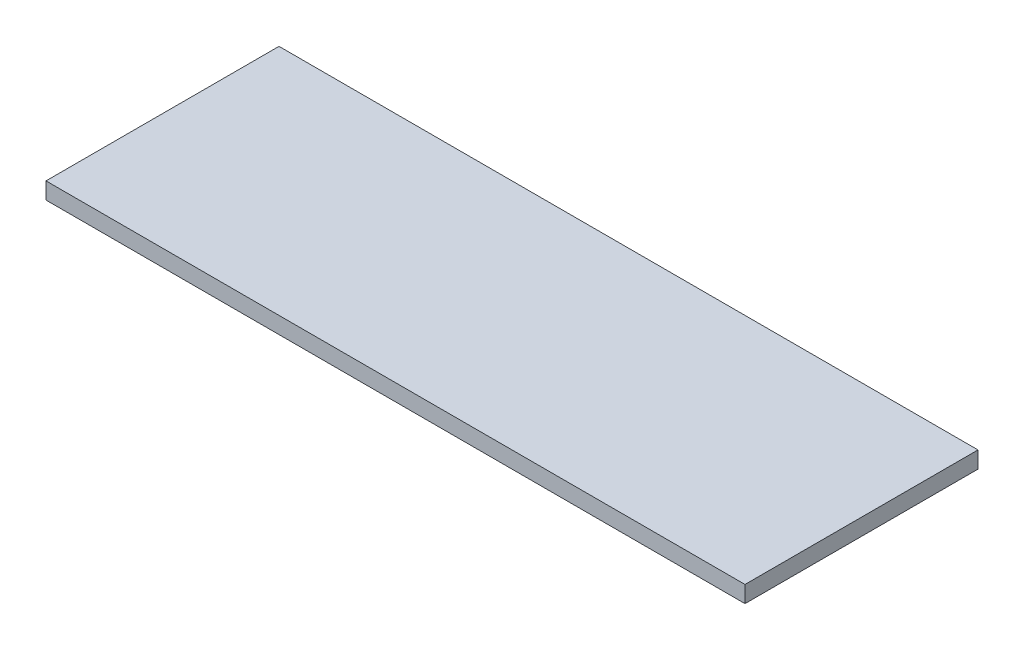
ISO-10303-21;
HEADER;
FILE_DESCRIPTION(('STEP AP214'),'2;1');
FILE_NAME('part.step','',(''),(''),'','','');
FILE_SCHEMA(('AUTOMOTIVE_DESIGN { 1 0 10303 214 1 1 1 1 }'));
ENDSEC;
DATA;
#1=APPLICATION_CONTEXT('core data for automotive mechanical design processes');
#2=APPLICATION_PROTOCOL_DEFINITION('international standard','automotive_design',2000,#1);
#3=PRODUCT_CONTEXT('',#1,'mechanical');
#4=PRODUCT('Part','Part','',(#3));
#5=PRODUCT_RELATED_PRODUCT_CATEGORY('part','',(#4));
#6=PRODUCT_DEFINITION_FORMATION('','',#4);
#7=PRODUCT_DEFINITION_CONTEXT('part definition',#1,'design');
#8=PRODUCT_DEFINITION('design','',#6,#7);
#9=PRODUCT_DEFINITION_SHAPE('','',#8);
#10=(LENGTH_UNIT() NAMED_UNIT(*) SI_UNIT(.MILLI.,.METRE.));
#11=(NAMED_UNIT(*) PLANE_ANGLE_UNIT() SI_UNIT($,.RADIAN.));
#12=(NAMED_UNIT(*) SI_UNIT($,.STERADIAN.) SOLID_ANGLE_UNIT());
#13=UNCERTAINTY_MEASURE_WITH_UNIT(LENGTH_MEASURE(1.E-05),#10,'distance_accuracy_value','');
#14=(GEOMETRIC_REPRESENTATION_CONTEXT(3) GLOBAL_UNCERTAINTY_ASSIGNED_CONTEXT((#13)) GLOBAL_UNIT_ASSIGNED_CONTEXT((#10,
#11,#12)) REPRESENTATION_CONTEXT('',''));
#15=CARTESIAN_POINT('',(0.,0.,0.));
#16=DIRECTION('',(0.,0.,1.));
#17=DIRECTION('',(1.,0.,0.));
#18=AXIS2_PLACEMENT_3D('',#15,#16,#17);
#19=CARTESIAN_POINT('',(21.,1.,-7.));
#20=DIRECTION('',(-1.,0.,0.));
#21=DIRECTION('',(0.,0.,1.));
#22=AXIS2_PLACEMENT_3D('',#19,#20,#21);
#23=PLANE('',#22);
#24=DIRECTION('',(0.,0.,-1.));
#25=VECTOR('',#24,1.);
#26=CARTESIAN_POINT('',(21.,0.,-7.));
#27=LINE('',#26,#25);
#28=CARTESIAN_POINT('',(21.,0.,7.));
#29=VERTEX_POINT('',#28);
#30=CARTESIAN_POINT('',(21.,0.,-7.));
#31=VERTEX_POINT('',#30);
#32=EDGE_CURVE('E100',#29,#31,#27,.T.);
#33=ORIENTED_EDGE('',*,*,#32,.T.);
#34=DIRECTION('',(0.,-1.,0.));
#35=VECTOR('',#34,1.);
#36=CARTESIAN_POINT('',(21.,1.,-7.));
#37=LINE('',#36,#35);
#38=CARTESIAN_POINT('',(21.,1.,-7.));
#39=VERTEX_POINT('',#38);
#40=EDGE_CURVE('E11',#39,#31,#37,.T.);
#41=ORIENTED_EDGE('',*,*,#40,.F.);
#42=DIRECTION('',(0.,0.,-1.));
#43=VECTOR('',#42,1.);
#44=CARTESIAN_POINT('',(21.,1.,-7.));
#45=LINE('',#44,#43);
#46=CARTESIAN_POINT('',(21.,1.,7.));
#47=VERTEX_POINT('',#46);
#48=EDGE_CURVE('E88',#47,#39,#45,.T.);
#49=ORIENTED_EDGE('',*,*,#48,.F.);
#50=DIRECTION('',(0.,-1.,0.));
#51=VECTOR('',#50,1.);
#52=CARTESIAN_POINT('',(21.,1.,7.));
#53=LINE('',#52,#51);
#54=EDGE_CURVE('E96',#47,#29,#53,.T.);
#55=ORIENTED_EDGE('',*,*,#54,.T.);
#56=EDGE_LOOP('',(#33,#41,#49,#55));
#57=FACE_BOUND('',#56,.T.);
#58=ADVANCED_FACE('F37',(#57),#23,.F.);
#59=CARTESIAN_POINT('',(-21.,1.,-7.));
#60=DIRECTION('',(0.,0.,1.));
#61=DIRECTION('',(1.,0.,0.));
#62=AXIS2_PLACEMENT_3D('',#59,#60,#61);
#63=PLANE('',#62);
#64=DIRECTION('',(-1.,0.,0.));
#65=VECTOR('',#64,1.);
#66=CARTESIAN_POINT('',(-21.,0.,-7.));
#67=LINE('',#66,#65);
#68=CARTESIAN_POINT('',(-21.,0.,-7.));
#69=VERTEX_POINT('',#68);
#70=EDGE_CURVE('E92',#31,#69,#67,.T.);
#71=ORIENTED_EDGE('',*,*,#70,.T.);
#72=DIRECTION('',(0.,-1.,0.));
#73=VECTOR('',#72,1.);
#74=CARTESIAN_POINT('',(-21.,1.,-7.));
#75=LINE('',#74,#73);
#76=CARTESIAN_POINT('',(-21.,1.,-7.));
#77=VERTEX_POINT('',#76);
#78=EDGE_CURVE('E45',#77,#69,#75,.T.);
#79=ORIENTED_EDGE('',*,*,#78,.F.);
#80=DIRECTION('',(-1.,0.,0.));
#81=VECTOR('',#80,1.);
#82=CARTESIAN_POINT('',(-21.,1.,-7.));
#83=LINE('',#82,#81);
#84=EDGE_CURVE('E83',#39,#77,#83,.T.);
#85=ORIENTED_EDGE('',*,*,#84,.F.);
#86=ORIENTED_EDGE('',*,*,#40,.T.);
#87=EDGE_LOOP('',(#71,#79,#85,#86));
#88=FACE_BOUND('',#87,.T.);
#89=ADVANCED_FACE('F91',(#88),#63,.F.);
#90=CARTESIAN_POINT('',(-21.,1.,-7.));
#91=DIRECTION('',(1.,0.,0.));
#92=DIRECTION('',(0.,0.,-1.));
#93=AXIS2_PLACEMENT_3D('',#90,#91,#92);
#94=PLANE('',#93);
#95=DIRECTION('',(0.,0.,1.));
#96=VECTOR('',#95,1.);
#97=CARTESIAN_POINT('',(-21.,0.,-7.));
#98=LINE('',#97,#96);
#99=CARTESIAN_POINT('',(-21.,0.,7.));
#100=VERTEX_POINT('',#99);
#101=EDGE_CURVE('E70',#69,#100,#98,.T.);
#102=ORIENTED_EDGE('',*,*,#101,.T.);
#103=DIRECTION('',(0.,-1.,0.));
#104=VECTOR('',#103,1.);
#105=CARTESIAN_POINT('',(-21.,1.,7.));
#106=LINE('',#105,#104);
#107=CARTESIAN_POINT('',(-21.,1.,7.));
#108=VERTEX_POINT('',#107);
#109=EDGE_CURVE('E93',#108,#100,#106,.T.);
#110=ORIENTED_EDGE('',*,*,#109,.F.);
#111=DIRECTION('',(0.,0.,1.));
#112=VECTOR('',#111,1.);
#113=CARTESIAN_POINT('',(-21.,1.,-7.));
#114=LINE('',#113,#112);
#115=EDGE_CURVE('E86',#77,#108,#114,.T.);
#116=ORIENTED_EDGE('',*,*,#115,.F.);
#117=ORIENTED_EDGE('',*,*,#78,.T.);
#118=EDGE_LOOP('',(#102,#110,#116,#117));
#119=FACE_BOUND('',#118,.T.);
#120=ADVANCED_FACE('F94',(#119),#94,.F.);
#121=CARTESIAN_POINT('',(-21.,1.,7.));
#122=DIRECTION('',(0.,0.,-1.));
#123=DIRECTION('',(-1.,0.,0.));
#124=AXIS2_PLACEMENT_3D('',#121,#122,#123);
#125=PLANE('',#124);
#126=DIRECTION('',(1.,0.,0.));
#127=VECTOR('',#126,1.);
#128=CARTESIAN_POINT('',(-21.,0.,7.));
#129=LINE('',#128,#127);
#130=EDGE_CURVE('E76',#100,#29,#129,.T.);
#131=ORIENTED_EDGE('',*,*,#130,.T.);
#132=ORIENTED_EDGE('',*,*,#54,.F.);
#133=DIRECTION('',(1.,0.,0.));
#134=VECTOR('',#133,1.);
#135=CARTESIAN_POINT('',(-21.,1.,7.));
#136=LINE('',#135,#134);
#137=EDGE_CURVE('E53',#108,#47,#136,.T.);
#138=ORIENTED_EDGE('',*,*,#137,.F.);
#139=ORIENTED_EDGE('',*,*,#109,.T.);
#140=EDGE_LOOP('',(#131,#132,#138,#139));
#141=FACE_BOUND('',#140,.T.);
#142=ADVANCED_FACE('F107',(#141),#125,.F.);
#143=CARTESIAN_POINT('',(0.,1.,0.));
#144=DIRECTION('',(0.,1.,0.));
#145=DIRECTION('',(0.,0.,1.));
#146=AXIS2_PLACEMENT_3D('',#143,#144,#145);
#147=PLANE('',#146);
#148=ORIENTED_EDGE('',*,*,#48,.T.);
#149=ORIENTED_EDGE('',*,*,#84,.T.);
#150=ORIENTED_EDGE('',*,*,#115,.T.);
#151=ORIENTED_EDGE('',*,*,#137,.T.);
#152=EDGE_LOOP('',(#148,#149,#150,#151));
#153=FACE_BOUND('',#152,.T.);
#154=ADVANCED_FACE('F84',(#153),#147,.T.);
#155=CARTESIAN_POINT('',(0.,0.,0.));
#156=DIRECTION('',(0.,1.,0.));
#157=DIRECTION('',(0.,0.,1.));
#158=AXIS2_PLACEMENT_3D('',#155,#156,#157);
#159=PLANE('',#158);
#160=ORIENTED_EDGE('',*,*,#32,.F.);
#161=ORIENTED_EDGE('',*,*,#130,.F.);
#162=ORIENTED_EDGE('',*,*,#101,.F.);
#163=ORIENTED_EDGE('',*,*,#70,.F.);
#164=EDGE_LOOP('',(#160,#161,#162,#163));
#165=FACE_BOUND('',#164,.T.);
#166=ADVANCED_FACE('F110',(#165),#159,.F.);
#167=CLOSED_SHELL('',(#58,#89,#120,#142,#154,#166));
#168=MANIFOLD_SOLID_BREP('B2',#167);
#169=ADVANCED_BREP_SHAPE_REPRESENTATION('',(#18,#168),#14);
#170=SHAPE_DEFINITION_REPRESENTATION(#9,#169);
ENDSEC;
END-ISO-10303-21;
